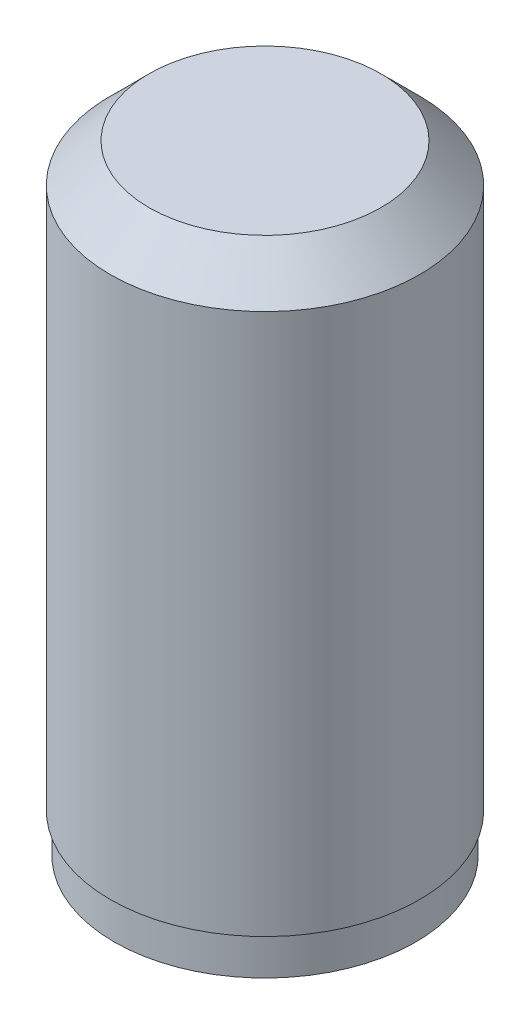
ISO-10303-21;
HEADER;
FILE_DESCRIPTION(('STEP AP214'),'2;1');
FILE_NAME('part.step','',(''),(''),'','','');
FILE_SCHEMA(('AUTOMOTIVE_DESIGN { 1 0 10303 214 1 1 1 1 }'));
ENDSEC;
DATA;
#1=APPLICATION_CONTEXT('core data for automotive mechanical design processes');
#2=APPLICATION_PROTOCOL_DEFINITION('international standard','automotive_design',2000,#1);
#3=PRODUCT_CONTEXT('',#1,'mechanical');
#4=PRODUCT('Part','Part','',(#3));
#5=PRODUCT_RELATED_PRODUCT_CATEGORY('part','',(#4));
#6=PRODUCT_DEFINITION_FORMATION('','',#4);
#7=PRODUCT_DEFINITION_CONTEXT('part definition',#1,'design');
#8=PRODUCT_DEFINITION('design','',#6,#7);
#9=PRODUCT_DEFINITION_SHAPE('','',#8);
#10=(LENGTH_UNIT() NAMED_UNIT(*) SI_UNIT(.MILLI.,.METRE.));
#11=(NAMED_UNIT(*) PLANE_ANGLE_UNIT() SI_UNIT($,.RADIAN.));
#12=(NAMED_UNIT(*) SI_UNIT($,.STERADIAN.) SOLID_ANGLE_UNIT());
#13=UNCERTAINTY_MEASURE_WITH_UNIT(LENGTH_MEASURE(1.E-05),#10,'distance_accuracy_value','');
#14=(GEOMETRIC_REPRESENTATION_CONTEXT(3) GLOBAL_UNCERTAINTY_ASSIGNED_CONTEXT((#13)) GLOBAL_UNIT_ASSIGNED_CONTEXT((#10,
#11,#12)) REPRESENTATION_CONTEXT('',''));
#15=CARTESIAN_POINT('',(0.,0.,0.));
#16=DIRECTION('',(0.,0.,1.));
#17=DIRECTION('',(1.,0.,0.));
#18=AXIS2_PLACEMENT_3D('',#15,#16,#17);
#19=CARTESIAN_POINT('',(0.,-0.5,0.));
#20=DIRECTION('',(0.,-1.,0.));
#21=DIRECTION('',(0.,0.,-1.));
#22=AXIS2_PLACEMENT_3D('',#19,#20,#21);
#23=PLANE('',#22);
#24=CARTESIAN_POINT('',(0.,-0.5,0.));
#25=DIRECTION('',(0.,-1.,0.));
#26=DIRECTION('',(0.,0.,-1.));
#27=AXIS2_PLACEMENT_3D('',#24,#25,#26);
#28=CIRCLE('',#27,0.25);
#29=CARTESIAN_POINT('',(0.,-0.5,-0.25));
#30=VERTEX_POINT('',#29);
#31=EDGE_CURVE('E11',#30,#30,#28,.T.);
#32=ORIENTED_EDGE('',*,*,#31,.T.);
#33=EDGE_LOOP('',(#32));
#34=FACE_BOUND('',#33,.T.);
#35=ADVANCED_FACE('F17',(#34),#23,.T.);
#36=CARTESIAN_POINT('',(0.,-0.5,0.));
#37=DIRECTION('',(0.,1.,0.));
#38=DIRECTION('',(0.,0.,1.));
#39=AXIS2_PLACEMENT_3D('',#36,#37,#38);
#40=CYLINDRICAL_SURFACE('',#39,0.25);
#41=ORIENTED_EDGE('',*,*,#31,.F.);
#42=EDGE_LOOP('',(#41));
#43=FACE_BOUND('',#42,.T.);
#44=CARTESIAN_POINT('',(0.,0.,0.));
#45=DIRECTION('',(0.,-1.,0.));
#46=DIRECTION('',(0.,0.,1.));
#47=AXIS2_PLACEMENT_3D('',#44,#45,#46);
#48=CIRCLE('',#47,0.25);
#49=CARTESIAN_POINT('',(0.,0.,0.25));
#50=VERTEX_POINT('',#49);
#51=EDGE_CURVE('E76',#50,#50,#48,.T.);
#52=ORIENTED_EDGE('',*,*,#51,.T.);
#53=EDGE_LOOP('',(#52));
#54=FACE_BOUND('',#53,.T.);
#55=ADVANCED_FACE('F161',(#43,#54),#40,.T.);
#56=CARTESIAN_POINT('',(0.,8.,0.));
#57=DIRECTION('',(0.,-1.,0.));
#58=DIRECTION('',(0.,0.,-1.));
#59=AXIS2_PLACEMENT_3D('',#56,#57,#58);
#60=CONICAL_SURFACE('',#59,1.5,0.785398163397446);
#61=CARTESIAN_POINT('',(0.,8.,0.));
#62=DIRECTION('',(0.,1.,0.));
#63=DIRECTION('',(0.,0.,1.));
#64=AXIS2_PLACEMENT_3D('',#61,#62,#63);
#65=CIRCLE('',#64,1.5);
#66=CARTESIAN_POINT('',(0.,8.,1.5));
#67=VERTEX_POINT('',#66);
#68=EDGE_CURVE('E20',#67,#67,#65,.T.);
#69=ORIENTED_EDGE('',*,*,#68,.F.);
#70=EDGE_LOOP('',(#69));
#71=FACE_BOUND('',#70,.T.);
#72=CARTESIAN_POINT('',(0.,7.5,0.));
#73=DIRECTION('',(0.,-1.,0.));
#74=DIRECTION('',(0.,0.,1.));
#75=AXIS2_PLACEMENT_3D('',#72,#73,#74);
#76=CIRCLE('',#75,2.);
#77=CARTESIAN_POINT('',(0.,7.5,2.));
#78=VERTEX_POINT('',#77);
#79=EDGE_CURVE('E83',#78,#78,#76,.T.);
#80=ORIENTED_EDGE('',*,*,#79,.F.);
#81=EDGE_LOOP('',(#80));
#82=FACE_BOUND('',#81,.T.);
#83=ADVANCED_FACE('F150',(#71,#82),#60,.T.);
#84=CARTESIAN_POINT('',(0.,0.5,0.));
#85=DIRECTION('',(0.,1.,0.));
#86=DIRECTION('',(1.,0.,0.));
#87=AXIS2_PLACEMENT_3D('',#84,#85,#86);
#88=PLANE('',#87);
#89=CARTESIAN_POINT('',(0.,0.5,0.));
#90=DIRECTION('',(0.,1.,0.));
#91=DIRECTION('',(0.,0.,1.));
#92=AXIS2_PLACEMENT_3D('',#89,#90,#91);
#93=CIRCLE('',#92,1.95);
#94=CARTESIAN_POINT('',(0.,0.5,1.95));
#95=VERTEX_POINT('',#94);
#96=EDGE_CURVE('E70',#95,#95,#93,.T.);
#97=ORIENTED_EDGE('',*,*,#96,.T.);
#98=EDGE_LOOP('',(#97));
#99=FACE_BOUND('',#98,.T.);
#100=CARTESIAN_POINT('',(0.,0.5,0.));
#101=DIRECTION('',(0.,1.,0.));
#102=DIRECTION('',(0.,0.,1.));
#103=AXIS2_PLACEMENT_3D('',#100,#101,#102);
#104=CIRCLE('',#103,2.);
#105=CARTESIAN_POINT('',(0.,0.5,2.));
#106=VERTEX_POINT('',#105);
#107=EDGE_CURVE('E81',#106,#106,#104,.T.);
#108=ORIENTED_EDGE('',*,*,#107,.F.);
#109=EDGE_LOOP('',(#108));
#110=FACE_BOUND('',#109,.T.);
#111=ADVANCED_FACE('F140',(#99,#110),#88,.F.);
#112=CARTESIAN_POINT('',(0.,8.,0.));
#113=DIRECTION('',(0.,1.,0.));
#114=DIRECTION('',(1.,0.,0.));
#115=AXIS2_PLACEMENT_3D('',#112,#113,#114);
#116=PLANE('',#115);
#117=ORIENTED_EDGE('',*,*,#68,.T.);
#118=EDGE_LOOP('',(#117));
#119=FACE_BOUND('',#118,.T.);
#120=ADVANCED_FACE('F130',(#119),#116,.T.);
#121=CARTESIAN_POINT('',(0.,8.,0.));
#122=DIRECTION('',(0.,-1.,0.));
#123=DIRECTION('',(0.,0.,-1.));
#124=AXIS2_PLACEMENT_3D('',#121,#122,#123);
#125=CYLINDRICAL_SURFACE('',#124,2.);
#126=ORIENTED_EDGE('',*,*,#79,.T.);
#127=EDGE_LOOP('',(#126));
#128=FACE_BOUND('',#127,.T.);
#129=ORIENTED_EDGE('',*,*,#107,.T.);
#130=EDGE_LOOP('',(#129));
#131=FACE_BOUND('',#130,.T.);
#132=ADVANCED_FACE('F119',(#128,#131),#125,.T.);
#133=CARTESIAN_POINT('',(0.,0.,0.));
#134=DIRECTION('',(0.,1.,0.));
#135=DIRECTION('',(1.,0.,0.));
#136=AXIS2_PLACEMENT_3D('',#133,#134,#135);
#137=PLANE('',#136);
#138=ORIENTED_EDGE('',*,*,#51,.F.);
#139=EDGE_LOOP('',(#138));
#140=FACE_BOUND('',#139,.T.);
#141=CARTESIAN_POINT('',(0.,0.,0.));
#142=DIRECTION('',(0.,1.,0.));
#143=DIRECTION('',(0.,0.,1.));
#144=AXIS2_PLACEMENT_3D('',#141,#142,#143);
#145=CIRCLE('',#144,1.95);
#146=CARTESIAN_POINT('',(0.,0.,1.95));
#147=VERTEX_POINT('',#146);
#148=EDGE_CURVE('E66',#147,#147,#145,.T.);
#149=ORIENTED_EDGE('',*,*,#148,.F.);
#150=EDGE_LOOP('',(#149));
#151=FACE_BOUND('',#150,.T.);
#152=ADVANCED_FACE('F107',(#140,#151),#137,.F.);
#153=CARTESIAN_POINT('',(0.,0.5,0.));
#154=DIRECTION('',(0.,-1.,0.));
#155=DIRECTION('',(0.,0.,-1.));
#156=AXIS2_PLACEMENT_3D('',#153,#154,#155);
#157=CYLINDRICAL_SURFACE('',#156,1.95);
#158=ORIENTED_EDGE('',*,*,#96,.F.);
#159=EDGE_LOOP('',(#158));
#160=FACE_BOUND('',#159,.T.);
#161=ORIENTED_EDGE('',*,*,#148,.T.);
#162=EDGE_LOOP('',(#161));
#163=FACE_BOUND('',#162,.T.);
#164=ADVANCED_FACE('F67',(#160,#163),#157,.T.);
#165=CLOSED_SHELL('',(#35,#55,#83,#111,#120,#132,#152,#164));
#166=MANIFOLD_SOLID_BREP('B1',#165);
#167=ADVANCED_BREP_SHAPE_REPRESENTATION('',(#18,#166),#14);
#168=SHAPE_DEFINITION_REPRESENTATION(#9,#167);
ENDSEC;
END-ISO-10303-21;
